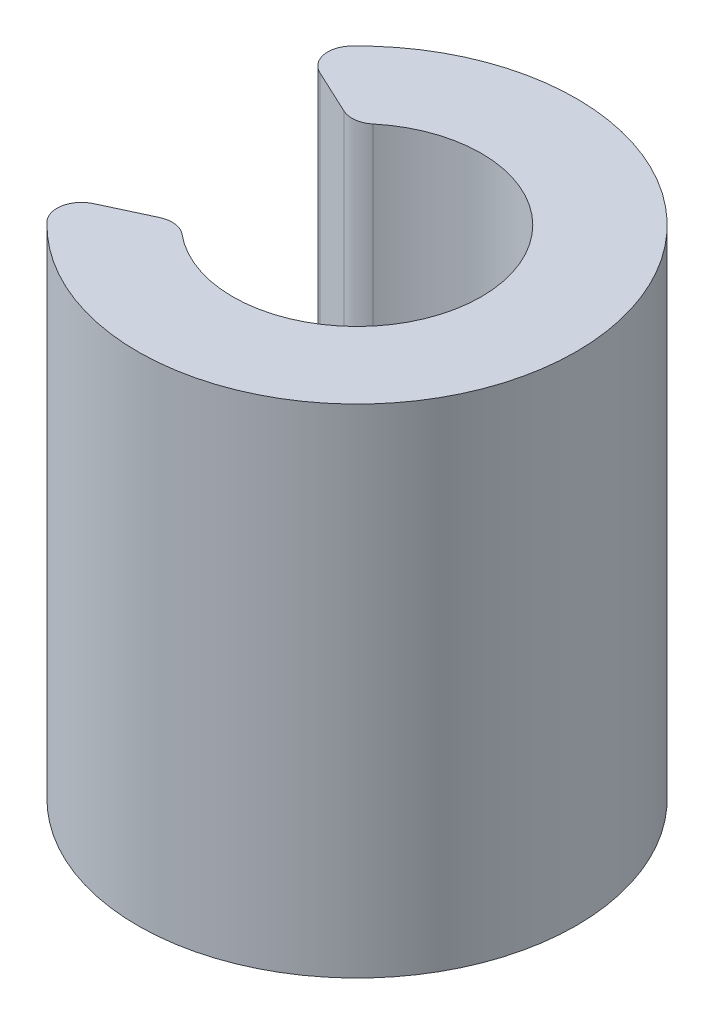
ISO-10303-21;
HEADER;
FILE_DESCRIPTION(('STEP AP214'),'2;1');
FILE_NAME('part.step','',(''),(''),'','','');
FILE_SCHEMA(('AUTOMOTIVE_DESIGN { 1 0 10303 214 1 1 1 1 }'));
ENDSEC;
DATA;
#1=APPLICATION_CONTEXT('core data for automotive mechanical design processes');
#2=APPLICATION_PROTOCOL_DEFINITION('international standard','automotive_design',2000,#1);
#3=PRODUCT_CONTEXT('',#1,'mechanical');
#4=PRODUCT('Part','Part','',(#3));
#5=PRODUCT_RELATED_PRODUCT_CATEGORY('part','',(#4));
#6=PRODUCT_DEFINITION_FORMATION('','',#4);
#7=PRODUCT_DEFINITION_CONTEXT('part definition',#1,'design');
#8=PRODUCT_DEFINITION('design','',#6,#7);
#9=PRODUCT_DEFINITION_SHAPE('','',#8);
#10=(LENGTH_UNIT() NAMED_UNIT(*) SI_UNIT(.MILLI.,.METRE.));
#11=(NAMED_UNIT(*) PLANE_ANGLE_UNIT() SI_UNIT($,.RADIAN.));
#12=(NAMED_UNIT(*) SI_UNIT($,.STERADIAN.) SOLID_ANGLE_UNIT());
#13=UNCERTAINTY_MEASURE_WITH_UNIT(LENGTH_MEASURE(1.E-05),#10,'distance_accuracy_value','');
#14=(GEOMETRIC_REPRESENTATION_CONTEXT(3) GLOBAL_UNCERTAINTY_ASSIGNED_CONTEXT((#13)) GLOBAL_UNIT_ASSIGNED_CONTEXT((#10,
#11,#12)) REPRESENTATION_CONTEXT('',''));
#15=CARTESIAN_POINT('',(0.,0.,0.));
#16=DIRECTION('',(0.,0.,1.));
#17=DIRECTION('',(1.,0.,0.));
#18=AXIS2_PLACEMENT_3D('',#15,#16,#17);
#19=CARTESIAN_POINT('',(0.,20.4,0.));
#20=DIRECTION('',(0.,-1.,0.));
#21=DIRECTION('',(0.,0.,-1.));
#22=AXIS2_PLACEMENT_3D('',#19,#20,#21);
#23=CYLINDRICAL_SURFACE('',#22,5.1);
#24=CARTESIAN_POINT('',(0.,0.,0.));
#25=DIRECTION('',(0.,-1.,0.));
#26=DIRECTION('',(0.,0.,1.));
#27=AXIS2_PLACEMENT_3D('',#24,#25,#26);
#28=CIRCLE('',#27,5.1);
#29=CARTESIAN_POINT('',(-3.25948412238655,0.,-3.92246902548764));
#30=VERTEX_POINT('',#29);
#31=CARTESIAN_POINT('',(-3.25948412238655,0.,3.92246902548764));
#32=VERTEX_POINT('',#31);
#33=EDGE_CURVE('E186',#30,#32,#28,.T.);
#34=ORIENTED_EDGE('',*,*,#33,.T.);
#35=DIRECTION('',(0.,-1.,0.));
#36=VECTOR('',#35,1.);
#37=CARTESIAN_POINT('',(-3.25948412238655,20.4,3.92246902548764));
#38=LINE('',#37,#36);
#39=CARTESIAN_POINT('',(-3.25948412238655,20.4,3.92246902548764));
#40=VERTEX_POINT('',#39);
#41=EDGE_CURVE('E11',#32,#40,#38,.F.);
#42=ORIENTED_EDGE('',*,*,#41,.T.);
#43=CARTESIAN_POINT('',(0.,20.4,0.));
#44=DIRECTION('',(0.,-1.,0.));
#45=DIRECTION('',(0.,0.,1.));
#46=AXIS2_PLACEMENT_3D('',#43,#44,#45);
#47=CIRCLE('',#46,5.1);
#48=CARTESIAN_POINT('',(-3.25948412238655,20.4,-3.92246902548764));
#49=VERTEX_POINT('',#48);
#50=EDGE_CURVE('E139',#49,#40,#47,.T.);
#51=ORIENTED_EDGE('',*,*,#50,.F.);
#52=DIRECTION('',(0.,-1.,0.));
#53=VECTOR('',#52,1.);
#54=CARTESIAN_POINT('',(-3.25948412238655,20.4,-3.92246902548764));
#55=LINE('',#54,#53);
#56=EDGE_CURVE('E52',#49,#30,#55,.T.);
#57=ORIENTED_EDGE('',*,*,#56,.T.);
#58=EDGE_LOOP('',(#34,#42,#51,#57));
#59=FACE_BOUND('',#58,.T.);
#60=ADVANCED_FACE('F43',(#59),#23,.F.);
#61=CARTESIAN_POINT('',(-3.70944739819828,20.4,3.5));
#62=DIRECTION('',(0.422618261740697,0.,0.906307787036651));
#63=DIRECTION('',(0.906307787036651,0.,-0.422618261740697));
#64=AXIS2_PLACEMENT_3D('',#61,#62,#63);
#65=PLANE('',#64);
#66=DIRECTION('',(-0.906307787036651,0.,0.422618261740697));
#67=VECTOR('',#66,1.);
#68=CARTESIAN_POINT('',(-3.70944739819828,0.,3.5));
#69=LINE('',#68,#67);
#70=CARTESIAN_POINT('',(-4.32121691792853,0.,3.78527281207602));
#71=VERTEX_POINT('',#70);
#72=CARTESIAN_POINT('',(-6.17744553777486,0.,4.65084643279684));
#73=VERTEX_POINT('',#72);
#74=EDGE_CURVE('E146',#71,#73,#69,.T.);
#75=ORIENTED_EDGE('',*,*,#74,.T.);
#76=DIRECTION('',(0.,-1.,0.));
#77=VECTOR('',#76,1.);
#78=CARTESIAN_POINT('',(-6.17744553777486,20.4,4.65084643279684));
#79=LINE('',#78,#77);
#80=CARTESIAN_POINT('',(-6.17744553777486,20.4,4.65084643279684));
#81=VERTEX_POINT('',#80);
#82=EDGE_CURVE('E59',#73,#81,#79,.F.);
#83=ORIENTED_EDGE('',*,*,#82,.T.);
#84=DIRECTION('',(-0.906307787036651,0.,0.422618261740697));
#85=VECTOR('',#84,1.);
#86=CARTESIAN_POINT('',(-3.70944739819828,20.4,3.5));
#87=LINE('',#86,#85);
#88=CARTESIAN_POINT('',(-4.32121691792853,20.4,3.78527281207602));
#89=VERTEX_POINT('',#88);
#90=EDGE_CURVE('E144',#89,#81,#87,.T.);
#91=ORIENTED_EDGE('',*,*,#90,.F.);
#92=DIRECTION('',(0.,-1.,0.));
#93=VECTOR('',#92,1.);
#94=CARTESIAN_POINT('',(-4.32121691792853,20.4,3.78527281207602));
#95=LINE('',#94,#93);
#96=EDGE_CURVE('E175',#89,#71,#95,.T.);
#97=ORIENTED_EDGE('',*,*,#96,.T.);
#98=EDGE_LOOP('',(#75,#83,#91,#97));
#99=FACE_BOUND('',#98,.T.);
#100=ADVANCED_FACE('F211',(#99),#65,.F.);
#101=CARTESIAN_POINT('',(0.,20.4,0.));
#102=DIRECTION('',(0.,-1.,0.));
#103=DIRECTION('',(0.,0.,-1.));
#104=AXIS2_PLACEMENT_3D('',#101,#102,#103);
#105=CYLINDRICAL_SURFACE('',#104,9.);
#106=CARTESIAN_POINT('',(0.,0.,0.));
#107=DIRECTION('',(0.,1.,0.));
#108=DIRECTION('',(0.,0.,1.));
#109=AXIS2_PLACEMENT_3D('',#106,#107,#108);
#110=CIRCLE('',#109,9.);
#111=CARTESIAN_POINT('',(-6.47418068553844,0.,6.25179849731268));
#112=VERTEX_POINT('',#111);
#113=CARTESIAN_POINT('',(-6.47418068553844,0.,-6.25179849731268));
#114=VERTEX_POINT('',#113);
#115=EDGE_CURVE('E140',#112,#114,#110,.T.);
#116=ORIENTED_EDGE('',*,*,#115,.T.);
#117=DIRECTION('',(0.,-1.,0.));
#118=VECTOR('',#117,1.);
#119=CARTESIAN_POINT('',(-6.47418068553844,20.4,-6.25179849731268));
#120=LINE('',#119,#118);
#121=CARTESIAN_POINT('',(-6.47418068553844,20.4,-6.25179849731268));
#122=VERTEX_POINT('',#121);
#123=EDGE_CURVE('E115',#114,#122,#120,.F.);
#124=ORIENTED_EDGE('',*,*,#123,.T.);
#125=CARTESIAN_POINT('',(0.,20.4,0.));
#126=DIRECTION('',(0.,1.,0.));
#127=DIRECTION('',(0.,0.,1.));
#128=AXIS2_PLACEMENT_3D('',#125,#126,#127);
#129=CIRCLE('',#128,9.);
#130=CARTESIAN_POINT('',(-6.47418068553844,20.4,6.25179849731268));
#131=VERTEX_POINT('',#130);
#132=EDGE_CURVE('E197',#131,#122,#129,.T.);
#133=ORIENTED_EDGE('',*,*,#132,.F.);
#134=DIRECTION('',(0.,-1.,0.));
#135=VECTOR('',#134,1.);
#136=CARTESIAN_POINT('',(-6.47418068553844,20.4,6.25179849731268));
#137=LINE('',#136,#135);
#138=EDGE_CURVE('E121',#131,#112,#137,.T.);
#139=ORIENTED_EDGE('',*,*,#138,.T.);
#140=EDGE_LOOP('',(#116,#124,#133,#139));
#141=FACE_BOUND('',#140,.T.);
#142=ADVANCED_FACE('F210',(#141),#105,.T.);
#143=CARTESIAN_POINT('',(-7.34806967371643,20.4,-5.19671743220746));
#144=DIRECTION('',(0.422618261740696,0.,-0.906307787036651));
#145=DIRECTION('',(-0.906307787036651,0.,-0.422618261740696));
#146=AXIS2_PLACEMENT_3D('',#143,#144,#145);
#147=PLANE('',#146);
#148=DIRECTION('',(0.906307787036651,0.,0.422618261740696));
#149=VECTOR('',#148,1.);
#150=CARTESIAN_POINT('',(-7.34806967371643,20.4,-5.19671743220746));
#151=LINE('',#150,#149);
#152=CARTESIAN_POINT('',(-6.17744553777486,20.4,-4.65084643279684));
#153=VERTEX_POINT('',#152);
#154=CARTESIAN_POINT('',(-4.32121691792853,20.4,-3.78527281207602));
#155=VERTEX_POINT('',#154);
#156=EDGE_CURVE('E131',#153,#155,#151,.T.);
#157=ORIENTED_EDGE('',*,*,#156,.F.);
#158=DIRECTION('',(0.,-1.,0.));
#159=VECTOR('',#158,1.);
#160=CARTESIAN_POINT('',(-6.17744553777486,20.4,-4.65084643279684));
#161=LINE('',#160,#159);
#162=CARTESIAN_POINT('',(-6.17744553777486,0.,-4.65084643279684));
#163=VERTEX_POINT('',#162);
#164=EDGE_CURVE('E114',#153,#163,#161,.T.);
#165=ORIENTED_EDGE('',*,*,#164,.T.);
#166=DIRECTION('',(0.906307787036651,0.,0.422618261740696));
#167=VECTOR('',#166,1.);
#168=CARTESIAN_POINT('',(-7.34806967371643,0.,-5.19671743220746));
#169=LINE('',#168,#167);
#170=CARTESIAN_POINT('',(-4.32121691792853,0.,-3.78527281207602));
#171=VERTEX_POINT('',#170);
#172=EDGE_CURVE('E128',#163,#171,#169,.T.);
#173=ORIENTED_EDGE('',*,*,#172,.T.);
#174=DIRECTION('',(0.,-1.,0.));
#175=VECTOR('',#174,1.);
#176=CARTESIAN_POINT('',(-4.32121691792853,20.4,-3.78527281207602));
#177=LINE('',#176,#175);
#178=EDGE_CURVE('E134',#171,#155,#177,.F.);
#179=ORIENTED_EDGE('',*,*,#178,.T.);
#180=EDGE_LOOP('',(#157,#165,#173,#179));
#181=FACE_BOUND('',#180,.T.);
#182=ADVANCED_FACE('F127',(#181),#147,.F.);
#183=CARTESIAN_POINT('',(0.,20.4,0.));
#184=DIRECTION('',(0.,1.,0.));
#185=DIRECTION('',(0.,0.,1.));
#186=AXIS2_PLACEMENT_3D('',#183,#184,#185);
#187=PLANE('',#186);
#188=ORIENTED_EDGE('',*,*,#132,.T.);
#189=CARTESIAN_POINT('',(-5.75482727603417,20.4,-5.55715421983349));
#190=DIRECTION('',(0.,1.,0.));
#191=DIRECTION('',(0.,0.,1.));
#192=AXIS2_PLACEMENT_3D('',#189,#190,#191);
#193=CIRCLE('',#192,1.);
#194=EDGE_CURVE('E172',#122,#153,#193,.T.);
#195=ORIENTED_EDGE('',*,*,#194,.T.);
#196=ORIENTED_EDGE('',*,*,#156,.T.);
#197=CARTESIAN_POINT('',(-3.89859865618783,20.4,-4.69158059911267));
#198=DIRECTION('',(0.,1.,0.));
#199=DIRECTION('',(0.,0.,1.));
#200=AXIS2_PLACEMENT_3D('',#197,#198,#199);
#201=CIRCLE('',#200,1.);
#202=EDGE_CURVE('E164',#155,#49,#201,.T.);
#203=ORIENTED_EDGE('',*,*,#202,.T.);
#204=ORIENTED_EDGE('',*,*,#50,.T.);
#205=CARTESIAN_POINT('',(-3.89859865618783,20.4,4.69158059911267));
#206=DIRECTION('',(0.,1.,0.));
#207=DIRECTION('',(0.,0.,1.));
#208=AXIS2_PLACEMENT_3D('',#205,#206,#207);
#209=CIRCLE('',#208,1.);
#210=EDGE_CURVE('E66',#40,#89,#209,.T.);
#211=ORIENTED_EDGE('',*,*,#210,.T.);
#212=ORIENTED_EDGE('',*,*,#90,.T.);
#213=CARTESIAN_POINT('',(-5.75482727603416,20.4,5.55715421983349));
#214=DIRECTION('',(0.,1.,0.));
#215=DIRECTION('',(0.,0.,1.));
#216=AXIS2_PLACEMENT_3D('',#213,#214,#215);
#217=CIRCLE('',#216,1.);
#218=EDGE_CURVE('E169',#81,#131,#217,.T.);
#219=ORIENTED_EDGE('',*,*,#218,.T.);
#220=EDGE_LOOP('',(#188,#195,#196,#203,#204,#211,#212,#219));
#221=FACE_BOUND('',#220,.T.);
#222=ADVANCED_FACE('F203',(#221),#187,.T.);
#223=CARTESIAN_POINT('',(0.,0.,0.));
#224=DIRECTION('',(0.,1.,0.));
#225=DIRECTION('',(0.,0.,1.));
#226=AXIS2_PLACEMENT_3D('',#223,#224,#225);
#227=PLANE('',#226);
#228=ORIENTED_EDGE('',*,*,#172,.F.);
#229=CARTESIAN_POINT('',(-5.75482727603417,0.,-5.55715421983349));
#230=DIRECTION('',(0.,1.,0.));
#231=DIRECTION('',(0.,0.,1.));
#232=AXIS2_PLACEMENT_3D('',#229,#230,#231);
#233=CIRCLE('',#232,1.);
#234=EDGE_CURVE('E110',#163,#114,#233,.F.);
#235=ORIENTED_EDGE('',*,*,#234,.T.);
#236=ORIENTED_EDGE('',*,*,#115,.F.);
#237=CARTESIAN_POINT('',(-5.75482727603416,0.,5.55715421983349));
#238=DIRECTION('',(0.,1.,0.));
#239=DIRECTION('',(0.,0.,1.));
#240=AXIS2_PLACEMENT_3D('',#237,#238,#239);
#241=CIRCLE('',#240,1.);
#242=EDGE_CURVE('E122',#112,#73,#241,.F.);
#243=ORIENTED_EDGE('',*,*,#242,.T.);
#244=ORIENTED_EDGE('',*,*,#74,.F.);
#245=CARTESIAN_POINT('',(-3.89859865618783,0.,4.69158059911267));
#246=DIRECTION('',(0.,1.,0.));
#247=DIRECTION('',(0.,0.,1.));
#248=AXIS2_PLACEMENT_3D('',#245,#246,#247);
#249=CIRCLE('',#248,1.);
#250=EDGE_CURVE('E154',#71,#32,#249,.F.);
#251=ORIENTED_EDGE('',*,*,#250,.T.);
#252=ORIENTED_EDGE('',*,*,#33,.F.);
#253=CARTESIAN_POINT('',(-3.89859865618783,0.,-4.69158059911267));
#254=DIRECTION('',(0.,1.,0.));
#255=DIRECTION('',(0.,0.,1.));
#256=AXIS2_PLACEMENT_3D('',#253,#254,#255);
#257=CIRCLE('',#256,1.);
#258=EDGE_CURVE('E133',#30,#171,#257,.F.);
#259=ORIENTED_EDGE('',*,*,#258,.T.);
#260=EDGE_LOOP('',(#228,#235,#236,#243,#244,#251,#252,#259));
#261=FACE_BOUND('',#260,.T.);
#262=ADVANCED_FACE('F136',(#261),#227,.F.);
#263=CARTESIAN_POINT('',(-5.75482727603417,20.4,-5.55715421983349));
#264=DIRECTION('',(0.,-1.,0.));
#265=DIRECTION('',(0.,0.,-1.));
#266=AXIS2_PLACEMENT_3D('',#263,#264,#265);
#267=CYLINDRICAL_SURFACE('',#266,1.);
#268=ORIENTED_EDGE('',*,*,#194,.F.);
#269=ORIENTED_EDGE('',*,*,#123,.F.);
#270=ORIENTED_EDGE('',*,*,#234,.F.);
#271=ORIENTED_EDGE('',*,*,#164,.F.);
#272=EDGE_LOOP('',(#268,#269,#270,#271));
#273=FACE_BOUND('',#272,.T.);
#274=ADVANCED_FACE('F113',(#273),#267,.T.);
#275=CARTESIAN_POINT('',(-5.75482727603416,20.4,5.55715421983349));
#276=DIRECTION('',(0.,-1.,0.));
#277=DIRECTION('',(0.,0.,-1.));
#278=AXIS2_PLACEMENT_3D('',#275,#276,#277);
#279=CYLINDRICAL_SURFACE('',#278,1.);
#280=ORIENTED_EDGE('',*,*,#218,.F.);
#281=ORIENTED_EDGE('',*,*,#82,.F.);
#282=ORIENTED_EDGE('',*,*,#242,.F.);
#283=ORIENTED_EDGE('',*,*,#138,.F.);
#284=EDGE_LOOP('',(#280,#281,#282,#283));
#285=FACE_BOUND('',#284,.T.);
#286=ADVANCED_FACE('F208',(#285),#279,.T.);
#287=CARTESIAN_POINT('',(-3.89859865618783,20.4,4.69158059911267));
#288=DIRECTION('',(0.,-1.,0.));
#289=DIRECTION('',(0.,0.,-1.));
#290=AXIS2_PLACEMENT_3D('',#287,#288,#289);
#291=CYLINDRICAL_SURFACE('',#290,1.);
#292=ORIENTED_EDGE('',*,*,#210,.F.);
#293=ORIENTED_EDGE('',*,*,#41,.F.);
#294=ORIENTED_EDGE('',*,*,#250,.F.);
#295=ORIENTED_EDGE('',*,*,#96,.F.);
#296=EDGE_LOOP('',(#292,#293,#294,#295));
#297=FACE_BOUND('',#296,.T.);
#298=ADVANCED_FACE('F213',(#297),#291,.T.);
#299=CARTESIAN_POINT('',(-3.89859865618783,20.4,-4.69158059911267));
#300=DIRECTION('',(0.,-1.,0.));
#301=DIRECTION('',(0.,0.,-1.));
#302=AXIS2_PLACEMENT_3D('',#299,#300,#301);
#303=CYLINDRICAL_SURFACE('',#302,1.);
#304=ORIENTED_EDGE('',*,*,#202,.F.);
#305=ORIENTED_EDGE('',*,*,#178,.F.);
#306=ORIENTED_EDGE('',*,*,#258,.F.);
#307=ORIENTED_EDGE('',*,*,#56,.F.);
#308=EDGE_LOOP('',(#304,#305,#306,#307));
#309=FACE_BOUND('',#308,.T.);
#310=ADVANCED_FACE('F45',(#309),#303,.T.);
#311=CLOSED_SHELL('',(#60,#100,#142,#182,#222,#262,#274,#286,#298,#310));
#312=MANIFOLD_SOLID_BREP('B2',#311);
#313=ADVANCED_BREP_SHAPE_REPRESENTATION('',(#18,#312),#14);
#314=SHAPE_DEFINITION_REPRESENTATION(#9,#313);
ENDSEC;
END-ISO-10303-21;
